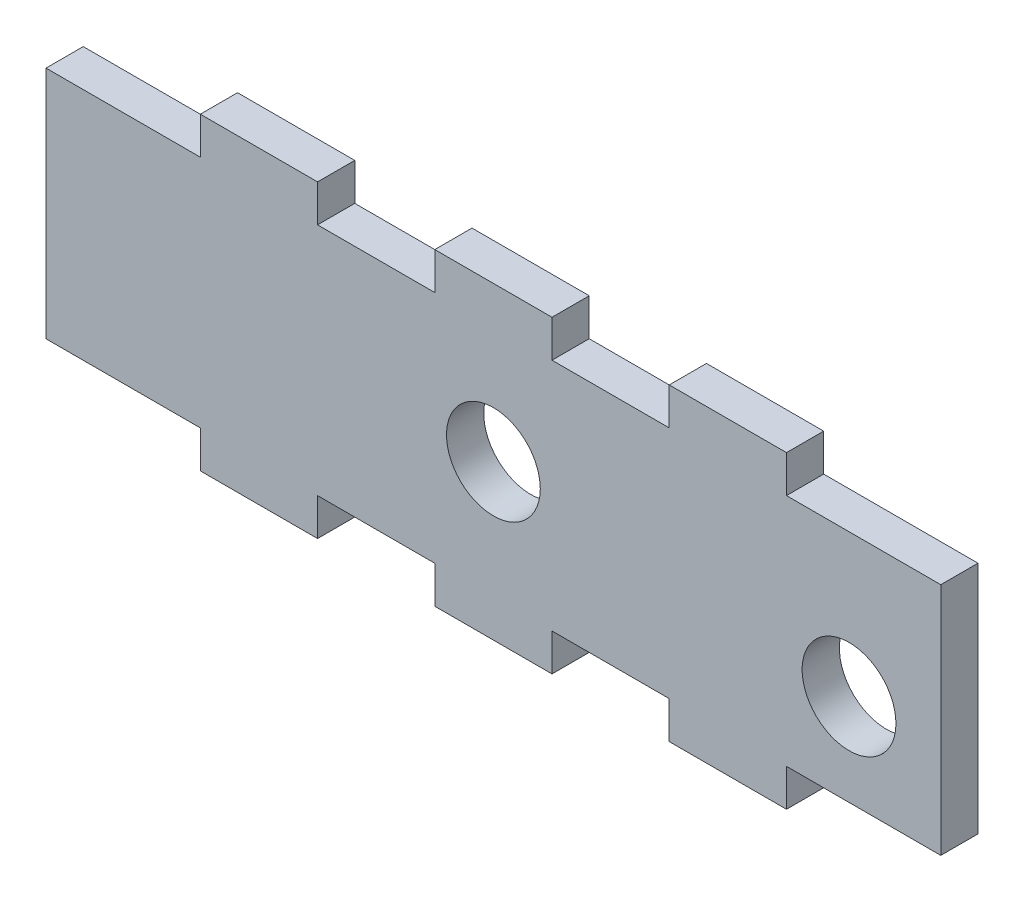
ISO-10303-21;
HEADER;
FILE_DESCRIPTION(('STEP AP214'),'2;1');
FILE_NAME('part.step','',(''),(''),'','','');
FILE_SCHEMA(('AUTOMOTIVE_DESIGN { 1 0 10303 214 1 1 1 1 }'));
ENDSEC;
DATA;
#1=APPLICATION_CONTEXT('core data for automotive mechanical design processes');
#2=APPLICATION_PROTOCOL_DEFINITION('international standard','automotive_design',2000,#1);
#3=PRODUCT_CONTEXT('',#1,'mechanical');
#4=PRODUCT('Part','Part','',(#3));
#5=PRODUCT_RELATED_PRODUCT_CATEGORY('part','',(#4));
#6=PRODUCT_DEFINITION_FORMATION('','',#4);
#7=PRODUCT_DEFINITION_CONTEXT('part definition',#1,'design');
#8=PRODUCT_DEFINITION('design','',#6,#7);
#9=PRODUCT_DEFINITION_SHAPE('','',#8);
#10=(LENGTH_UNIT() NAMED_UNIT(*) SI_UNIT(.MILLI.,.METRE.));
#11=(NAMED_UNIT(*) PLANE_ANGLE_UNIT() SI_UNIT($,.RADIAN.));
#12=(NAMED_UNIT(*) SI_UNIT($,.STERADIAN.) SOLID_ANGLE_UNIT());
#13=UNCERTAINTY_MEASURE_WITH_UNIT(LENGTH_MEASURE(1.E-05),#10,'distance_accuracy_value','');
#14=(GEOMETRIC_REPRESENTATION_CONTEXT(3) GLOBAL_UNCERTAINTY_ASSIGNED_CONTEXT((#13)) GLOBAL_UNIT_ASSIGNED_CONTEXT((#10,
#11,#12)) REPRESENTATION_CONTEXT('',''));
#15=CARTESIAN_POINT('',(0.,0.,0.));
#16=DIRECTION('',(0.,0.,1.));
#17=DIRECTION('',(1.,0.,0.));
#18=AXIS2_PLACEMENT_3D('',#15,#16,#17);
#19=CARTESIAN_POINT('',(-82.675,26.35,6.35));
#20=DIRECTION('',(0.,-1.,0.));
#21=DIRECTION('',(0.,0.,-1.));
#22=AXIS2_PLACEMENT_3D('',#19,#20,#21);
#23=PLANE('',#22);
#24=DIRECTION('',(0.,0.,1.));
#25=VECTOR('',#24,1.);
#26=CARTESIAN_POINT('',(-50.,26.35,0.));
#27=LINE('',#26,#25);
#28=CARTESIAN_POINT('',(-50.,26.35,0.));
#29=VERTEX_POINT('',#28);
#30=CARTESIAN_POINT('',(-50.,26.35,6.35));
#31=VERTEX_POINT('',#30);
#32=EDGE_CURVE('E422',#29,#31,#27,.T.);
#33=ORIENTED_EDGE('',*,*,#32,.T.);
#34=DIRECTION('',(-1.,0.,0.));
#35=VECTOR('',#34,1.);
#36=CARTESIAN_POINT('',(-82.675,26.35,6.35));
#37=LINE('',#36,#35);
#38=CARTESIAN_POINT('',(-30.,26.35,6.35));
#39=VERTEX_POINT('',#38);
#40=EDGE_CURVE('E51',#39,#31,#37,.T.);
#41=ORIENTED_EDGE('',*,*,#40,.F.);
#42=DIRECTION('',(0.,0.,1.));
#43=VECTOR('',#42,1.);
#44=CARTESIAN_POINT('',(-30.,26.35,0.));
#45=LINE('',#44,#43);
#46=CARTESIAN_POINT('',(-30.,26.35,0.));
#47=VERTEX_POINT('',#46);
#48=EDGE_CURVE('E263',#47,#39,#45,.T.);
#49=ORIENTED_EDGE('',*,*,#48,.F.);
#50=DIRECTION('',(-1.,0.,0.));
#51=VECTOR('',#50,1.);
#52=CARTESIAN_POINT('',(-82.675,26.35,0.));
#53=LINE('',#52,#51);
#54=EDGE_CURVE('E43',#47,#29,#53,.T.);
#55=ORIENTED_EDGE('',*,*,#54,.T.);
#56=EDGE_LOOP('',(#33,#41,#49,#55));
#57=FACE_BOUND('',#56,.T.);
#58=ADVANCED_FACE('F39',(#57),#23,.F.);
#59=DIRECTION('',(0.,0.,1.));
#60=VECTOR('',#59,1.);
#61=CARTESIAN_POINT('',(50.,26.35,0.));
#62=LINE('',#61,#60);
#63=CARTESIAN_POINT('',(50.,26.35,0.));
#64=VERTEX_POINT('',#63);
#65=CARTESIAN_POINT('',(50.,26.35,6.35));
#66=VERTEX_POINT('',#65);
#67=EDGE_CURVE('E351',#64,#66,#62,.T.);
#68=ORIENTED_EDGE('',*,*,#67,.F.);
#69=CARTESIAN_POINT('',(30.,26.35,0.));
#70=VERTEX_POINT('',#69);
#71=EDGE_CURVE('E314',#64,#70,#53,.T.);
#72=ORIENTED_EDGE('',*,*,#71,.T.);
#73=DIRECTION('',(0.,0.,1.));
#74=VECTOR('',#73,1.);
#75=CARTESIAN_POINT('',(30.,26.35,0.));
#76=LINE('',#75,#74);
#77=CARTESIAN_POINT('',(30.,26.35,6.35));
#78=VERTEX_POINT('',#77);
#79=EDGE_CURVE('E350',#70,#78,#76,.T.);
#80=ORIENTED_EDGE('',*,*,#79,.T.);
#81=EDGE_CURVE('E11',#66,#78,#37,.T.);
#82=ORIENTED_EDGE('',*,*,#81,.F.);
#83=EDGE_LOOP('',(#68,#72,#80,#82));
#84=FACE_BOUND('',#83,.T.);
#85=ADVANCED_FACE('F348',(#84),#23,.F.);
#86=DIRECTION('',(0.,0.,1.));
#87=VECTOR('',#86,1.);
#88=CARTESIAN_POINT('',(9.99999999999999,26.35,0.));
#89=LINE('',#88,#87);
#90=CARTESIAN_POINT('',(9.99999999999999,26.35,0.));
#91=VERTEX_POINT('',#90);
#92=CARTESIAN_POINT('',(9.99999999999999,26.35,6.35));
#93=VERTEX_POINT('',#92);
#94=EDGE_CURVE('E385',#91,#93,#89,.T.);
#95=ORIENTED_EDGE('',*,*,#94,.F.);
#96=CARTESIAN_POINT('',(-10.,26.35,0.));
#97=VERTEX_POINT('',#96);
#98=EDGE_CURVE('E335',#91,#97,#53,.T.);
#99=ORIENTED_EDGE('',*,*,#98,.T.);
#100=DIRECTION('',(0.,0.,1.));
#101=VECTOR('',#100,1.);
#102=CARTESIAN_POINT('',(-10.,26.35,0.));
#103=LINE('',#102,#101);
#104=CARTESIAN_POINT('',(-10.,26.35,6.35));
#105=VERTEX_POINT('',#104);
#106=EDGE_CURVE('E460',#97,#105,#103,.T.);
#107=ORIENTED_EDGE('',*,*,#106,.T.);
#108=EDGE_CURVE('E49',#93,#105,#37,.T.);
#109=ORIENTED_EDGE('',*,*,#108,.F.);
#110=EDGE_LOOP('',(#95,#99,#107,#109));
#111=FACE_BOUND('',#110,.T.);
#112=ADVANCED_FACE('F587',(#111),#23,.F.);
#113=CARTESIAN_POINT('',(0.,0.,6.35));
#114=DIRECTION('',(0.,0.,1.));
#115=DIRECTION('',(1.,0.,0.));
#116=AXIS2_PLACEMENT_3D('',#113,#114,#115);
#117=PLANE('',#116);
#118=CARTESIAN_POINT('',(0.,0.,6.35));
#119=DIRECTION('',(0.,0.,1.));
#120=DIRECTION('',(1.,0.,0.));
#121=AXIS2_PLACEMENT_3D('',#118,#119,#120);
#122=CIRCLE('',#121,8.);
#123=CARTESIAN_POINT('',(8.,0.,6.35));
#124=VERTEX_POINT('',#123);
#125=EDGE_CURVE('E820',#124,#124,#122,.T.);
#126=ORIENTED_EDGE('',*,*,#125,.F.);
#127=EDGE_LOOP('',(#126));
#128=FACE_BOUND('',#127,.T.);
#129=CARTESIAN_POINT('',(60.675,-4.35,6.35));
#130=DIRECTION('',(0.,0.,1.));
#131=DIRECTION('',(1.,0.,0.));
#132=AXIS2_PLACEMENT_3D('',#129,#130,#131);
#133=CIRCLE('',#132,8.00000000000002);
#134=CARTESIAN_POINT('',(68.675,-4.35,6.35));
#135=VERTEX_POINT('',#134);
#136=EDGE_CURVE('E828',#135,#135,#133,.T.);
#137=ORIENTED_EDGE('',*,*,#136,.F.);
#138=EDGE_LOOP('',(#137));
#139=FACE_BOUND('',#138,.T.);
#140=DIRECTION('',(0.,1.,0.));
#141=VECTOR('',#140,1.);
#142=CARTESIAN_POINT('',(-76.325,26.35,6.35));
#143=LINE('',#142,#141);
#144=CARTESIAN_POINT('',(-76.325,-20.,6.35));
#145=VERTEX_POINT('',#144);
#146=CARTESIAN_POINT('',(-76.325,20.,6.35));
#147=VERTEX_POINT('',#146);
#148=EDGE_CURVE('E230',#145,#147,#143,.T.);
#149=ORIENTED_EDGE('',*,*,#148,.F.);
#150=DIRECTION('',(-1.,0.,0.));
#151=VECTOR('',#150,1.);
#152=CARTESIAN_POINT('',(-50.,-20.,6.35));
#153=LINE('',#152,#151);
#154=CARTESIAN_POINT('',(-50.,-20.,6.35));
#155=VERTEX_POINT('',#154);
#156=EDGE_CURVE('E247',#155,#145,#153,.T.);
#157=ORIENTED_EDGE('',*,*,#156,.F.);
#158=DIRECTION('',(0.,1.,0.));
#159=VECTOR('',#158,1.);
#160=CARTESIAN_POINT('',(-50.,-26.35,6.35));
#161=LINE('',#160,#159);
#162=CARTESIAN_POINT('',(-50.,-26.35,6.35));
#163=VERTEX_POINT('',#162);
#164=EDGE_CURVE('E256',#163,#155,#161,.T.);
#165=ORIENTED_EDGE('',*,*,#164,.F.);
#166=DIRECTION('',(1.,0.,0.));
#167=VECTOR('',#166,1.);
#168=CARTESIAN_POINT('',(-82.675,-26.35,6.35));
#169=LINE('',#168,#167);
#170=CARTESIAN_POINT('',(-30.,-26.35,6.35));
#171=VERTEX_POINT('',#170);
#172=EDGE_CURVE('E315',#163,#171,#169,.T.);
#173=ORIENTED_EDGE('',*,*,#172,.T.);
#174=DIRECTION('',(0.,-1.,0.));
#175=VECTOR('',#174,1.);
#176=CARTESIAN_POINT('',(-30.,-26.35,6.35));
#177=LINE('',#176,#175);
#178=CARTESIAN_POINT('',(-30.,-20.,6.35));
#179=VERTEX_POINT('',#178);
#180=EDGE_CURVE('E286',#179,#171,#177,.T.);
#181=ORIENTED_EDGE('',*,*,#180,.F.);
#182=DIRECTION('',(-1.,0.,0.));
#183=VECTOR('',#182,1.);
#184=CARTESIAN_POINT('',(-30.,-20.,6.35));
#185=LINE('',#184,#183);
#186=CARTESIAN_POINT('',(-10.,-20.,6.35));
#187=VERTEX_POINT('',#186);
#188=EDGE_CURVE('E277',#187,#179,#185,.T.);
#189=ORIENTED_EDGE('',*,*,#188,.F.);
#190=DIRECTION('',(0.,1.,0.));
#191=VECTOR('',#190,1.);
#192=CARTESIAN_POINT('',(-10.,-26.35,6.35));
#193=LINE('',#192,#191);
#194=CARTESIAN_POINT('',(-10.,-26.35,6.35));
#195=VERTEX_POINT('',#194);
#196=EDGE_CURVE('E289',#195,#187,#193,.T.);
#197=ORIENTED_EDGE('',*,*,#196,.F.);
#198=CARTESIAN_POINT('',(9.99999999999999,-26.35,6.35));
#199=VERTEX_POINT('',#198);
#200=EDGE_CURVE('E313',#195,#199,#169,.T.);
#201=ORIENTED_EDGE('',*,*,#200,.T.);
#202=DIRECTION('',(0.,-1.,0.));
#203=VECTOR('',#202,1.);
#204=CARTESIAN_POINT('',(9.99999999999999,-26.35,6.35));
#205=LINE('',#204,#203);
#206=CARTESIAN_POINT('',(9.99999999999999,-20.,6.35));
#207=VERTEX_POINT('',#206);
#208=EDGE_CURVE('E483',#207,#199,#205,.T.);
#209=ORIENTED_EDGE('',*,*,#208,.F.);
#210=DIRECTION('',(-1.,0.,0.));
#211=VECTOR('',#210,1.);
#212=CARTESIAN_POINT('',(9.99999999999999,-20.,6.35));
#213=LINE('',#212,#211);
#214=CARTESIAN_POINT('',(30.,-20.,6.35));
#215=VERTEX_POINT('',#214);
#216=EDGE_CURVE('E474',#215,#207,#213,.T.);
#217=ORIENTED_EDGE('',*,*,#216,.F.);
#218=DIRECTION('',(0.,1.,0.));
#219=VECTOR('',#218,1.);
#220=CARTESIAN_POINT('',(30.,-26.35,6.35));
#221=LINE('',#220,#219);
#222=CARTESIAN_POINT('',(30.,-26.35,6.35));
#223=VERTEX_POINT('',#222);
#224=EDGE_CURVE('E486',#223,#215,#221,.T.);
#225=ORIENTED_EDGE('',*,*,#224,.F.);
#226=CARTESIAN_POINT('',(50.,-26.35,6.35));
#227=VERTEX_POINT('',#226);
#228=EDGE_CURVE('E310',#223,#227,#169,.T.);
#229=ORIENTED_EDGE('',*,*,#228,.T.);
#230=DIRECTION('',(0.,-1.,0.));
#231=VECTOR('',#230,1.);
#232=CARTESIAN_POINT('',(50.,-26.35,6.35));
#233=LINE('',#232,#231);
#234=CARTESIAN_POINT('',(50.,-20.,6.35));
#235=VERTEX_POINT('',#234);
#236=EDGE_CURVE('E268',#235,#227,#233,.T.);
#237=ORIENTED_EDGE('',*,*,#236,.F.);
#238=DIRECTION('',(-1.,0.,0.));
#239=VECTOR('',#238,1.);
#240=CARTESIAN_POINT('',(50.,-20.,6.35));
#241=LINE('',#240,#239);
#242=CARTESIAN_POINT('',(76.325,-20.,6.35));
#243=VERTEX_POINT('',#242);
#244=EDGE_CURVE('E510',#243,#235,#241,.T.);
#245=ORIENTED_EDGE('',*,*,#244,.F.);
#246=DIRECTION('',(0.,-1.,0.));
#247=VECTOR('',#246,1.);
#248=CARTESIAN_POINT('',(76.325,-26.35,6.35));
#249=LINE('',#248,#247);
#250=CARTESIAN_POINT('',(76.325,20.,6.35));
#251=VERTEX_POINT('',#250);
#252=EDGE_CURVE('E566',#251,#243,#249,.T.);
#253=ORIENTED_EDGE('',*,*,#252,.F.);
#254=DIRECTION('',(-1.,0.,0.));
#255=VECTOR('',#254,1.);
#256=CARTESIAN_POINT('',(50.,20.,6.35));
#257=LINE('',#256,#255);
#258=CARTESIAN_POINT('',(50.,20.,6.35));
#259=VERTEX_POINT('',#258);
#260=EDGE_CURVE('E396',#251,#259,#257,.T.);
#261=ORIENTED_EDGE('',*,*,#260,.T.);
#262=DIRECTION('',(0.,1.,0.));
#263=VECTOR('',#262,1.);
#264=CARTESIAN_POINT('',(50.,26.35,6.35));
#265=LINE('',#264,#263);
#266=EDGE_CURVE('E400',#259,#66,#265,.T.);
#267=ORIENTED_EDGE('',*,*,#266,.T.);
#268=ORIENTED_EDGE('',*,*,#81,.T.);
#269=DIRECTION('',(0.,-1.,0.));
#270=VECTOR('',#269,1.);
#271=CARTESIAN_POINT('',(30.,26.35,6.35));
#272=LINE('',#271,#270);
#273=CARTESIAN_POINT('',(30.,20.,6.35));
#274=VERTEX_POINT('',#273);
#275=EDGE_CURVE('E381',#78,#274,#272,.T.);
#276=ORIENTED_EDGE('',*,*,#275,.T.);
#277=DIRECTION('',(-1.,0.,0.));
#278=VECTOR('',#277,1.);
#279=CARTESIAN_POINT('',(9.99999999999999,20.,6.35));
#280=LINE('',#279,#278);
#281=CARTESIAN_POINT('',(9.99999999999999,20.,6.35));
#282=VERTEX_POINT('',#281);
#283=EDGE_CURVE('E377',#274,#282,#280,.T.);
#284=ORIENTED_EDGE('',*,*,#283,.T.);
#285=DIRECTION('',(0.,1.,0.));
#286=VECTOR('',#285,1.);
#287=CARTESIAN_POINT('',(9.99999999999999,26.35,6.35));
#288=LINE('',#287,#286);
#289=EDGE_CURVE('E373',#282,#93,#288,.T.);
#290=ORIENTED_EDGE('',*,*,#289,.T.);
#291=ORIENTED_EDGE('',*,*,#108,.T.);
#292=DIRECTION('',(0.,-1.,0.));
#293=VECTOR('',#292,1.);
#294=CARTESIAN_POINT('',(-10.,26.35,6.35));
#295=LINE('',#294,#293);
#296=CARTESIAN_POINT('',(-10.,20.,6.35));
#297=VERTEX_POINT('',#296);
#298=EDGE_CURVE('E440',#105,#297,#295,.T.);
#299=ORIENTED_EDGE('',*,*,#298,.T.);
#300=DIRECTION('',(-1.,0.,0.));
#301=VECTOR('',#300,1.);
#302=CARTESIAN_POINT('',(-30.,20.,6.35));
#303=LINE('',#302,#301);
#304=CARTESIAN_POINT('',(-30.,20.,6.35));
#305=VERTEX_POINT('',#304);
#306=EDGE_CURVE('E451',#297,#305,#303,.T.);
#307=ORIENTED_EDGE('',*,*,#306,.T.);
#308=DIRECTION('',(0.,1.,0.));
#309=VECTOR('',#308,1.);
#310=CARTESIAN_POINT('',(-30.,26.35,6.35));
#311=LINE('',#310,#309);
#312=EDGE_CURVE('E388',#305,#39,#311,.T.);
#313=ORIENTED_EDGE('',*,*,#312,.T.);
#314=ORIENTED_EDGE('',*,*,#40,.T.);
#315=DIRECTION('',(0.,-1.,0.));
#316=VECTOR('',#315,1.);
#317=CARTESIAN_POINT('',(-50.,26.35,6.35));
#318=LINE('',#317,#316);
#319=CARTESIAN_POINT('',(-50.,20.,6.35));
#320=VERTEX_POINT('',#319);
#321=EDGE_CURVE('E423',#31,#320,#318,.T.);
#322=ORIENTED_EDGE('',*,*,#321,.T.);
#323=DIRECTION('',(-1.,0.,0.));
#324=VECTOR('',#323,1.);
#325=CARTESIAN_POINT('',(-50.,20.,6.35));
#326=LINE('',#325,#324);
#327=EDGE_CURVE('E249',#320,#147,#326,.T.);
#328=ORIENTED_EDGE('',*,*,#327,.T.);
#329=EDGE_LOOP('',(#149,#157,#165,#173,#181,#189,#197,#201,#209,#217,#225,#229,#237,#245,#253,
#261,#267,#268,#276,#284,#290,#291,#299,#307,#313,#314,#322,#328));
#330=FACE_BOUND('',#329,.T.);
#331=ADVANCED_FACE('F245',(#128,#139,#330),#117,.T.);
#332=CARTESIAN_POINT('',(0.,0.,0.));
#333=DIRECTION('',(0.,0.,1.));
#334=DIRECTION('',(1.,0.,0.));
#335=AXIS2_PLACEMENT_3D('',#332,#333,#334);
#336=PLANE('',#335);
#337=CARTESIAN_POINT('',(0.,0.,0.));
#338=DIRECTION('',(0.,0.,1.));
#339=DIRECTION('',(1.,0.,0.));
#340=AXIS2_PLACEMENT_3D('',#337,#338,#339);
#341=CIRCLE('',#340,8.);
#342=CARTESIAN_POINT('',(8.,0.,0.));
#343=VERTEX_POINT('',#342);
#344=EDGE_CURVE('E569',#343,#343,#341,.T.);
#345=ORIENTED_EDGE('',*,*,#344,.T.);
#346=EDGE_LOOP('',(#345));
#347=FACE_BOUND('',#346,.T.);
#348=CARTESIAN_POINT('',(60.675,-4.35,0.));
#349=DIRECTION('',(0.,0.,1.));
#350=DIRECTION('',(1.,0.,0.));
#351=AXIS2_PLACEMENT_3D('',#348,#349,#350);
#352=CIRCLE('',#351,8.00000000000002);
#353=CARTESIAN_POINT('',(68.675,-4.35,0.));
#354=VERTEX_POINT('',#353);
#355=EDGE_CURVE('E822',#354,#354,#352,.T.);
#356=ORIENTED_EDGE('',*,*,#355,.T.);
#357=EDGE_LOOP('',(#356));
#358=FACE_BOUND('',#357,.T.);
#359=DIRECTION('',(-1.,0.,0.));
#360=VECTOR('',#359,1.);
#361=CARTESIAN_POINT('',(-50.,-20.,0.));
#362=LINE('',#361,#360);
#363=CARTESIAN_POINT('',(-50.,-20.,0.));
#364=VERTEX_POINT('',#363);
#365=CARTESIAN_POINT('',(-76.325,-20.,0.));
#366=VERTEX_POINT('',#365);
#367=EDGE_CURVE('E261',#364,#366,#362,.T.);
#368=ORIENTED_EDGE('',*,*,#367,.T.);
#369=DIRECTION('',(0.,1.,0.));
#370=VECTOR('',#369,1.);
#371=CARTESIAN_POINT('',(-76.325,26.35,0.));
#372=LINE('',#371,#370);
#373=CARTESIAN_POINT('',(-76.325,20.,0.));
#374=VERTEX_POINT('',#373);
#375=EDGE_CURVE('E233',#366,#374,#372,.T.);
#376=ORIENTED_EDGE('',*,*,#375,.T.);
#377=DIRECTION('',(-1.,0.,0.));
#378=VECTOR('',#377,1.);
#379=CARTESIAN_POINT('',(-50.,20.,0.));
#380=LINE('',#379,#378);
#381=CARTESIAN_POINT('',(-50.,20.,0.));
#382=VERTEX_POINT('',#381);
#383=EDGE_CURVE('E418',#382,#374,#380,.T.);
#384=ORIENTED_EDGE('',*,*,#383,.F.);
#385=DIRECTION('',(0.,-1.,0.));
#386=VECTOR('',#385,1.);
#387=CARTESIAN_POINT('',(-50.,26.35,0.));
#388=LINE('',#387,#386);
#389=EDGE_CURVE('E415',#29,#382,#388,.T.);
#390=ORIENTED_EDGE('',*,*,#389,.F.);
#391=ORIENTED_EDGE('',*,*,#54,.F.);
#392=DIRECTION('',(0.,1.,0.));
#393=VECTOR('',#392,1.);
#394=CARTESIAN_POINT('',(-30.,26.35,0.));
#395=LINE('',#394,#393);
#396=CARTESIAN_POINT('',(-30.,20.,0.));
#397=VERTEX_POINT('',#396);
#398=EDGE_CURVE('E436',#397,#47,#395,.T.);
#399=ORIENTED_EDGE('',*,*,#398,.F.);
#400=DIRECTION('',(-1.,0.,0.));
#401=VECTOR('',#400,1.);
#402=CARTESIAN_POINT('',(-30.,20.,0.));
#403=LINE('',#402,#401);
#404=CARTESIAN_POINT('',(-10.,20.,0.));
#405=VERTEX_POINT('',#404);
#406=EDGE_CURVE('E439',#405,#397,#403,.T.);
#407=ORIENTED_EDGE('',*,*,#406,.F.);
#408=DIRECTION('',(0.,-1.,0.));
#409=VECTOR('',#408,1.);
#410=CARTESIAN_POINT('',(-10.,26.35,0.));
#411=LINE('',#410,#409);
#412=EDGE_CURVE('E443',#97,#405,#411,.T.);
#413=ORIENTED_EDGE('',*,*,#412,.F.);
#414=ORIENTED_EDGE('',*,*,#98,.F.);
#415=DIRECTION('',(0.,1.,0.));
#416=VECTOR('',#415,1.);
#417=CARTESIAN_POINT('',(9.99999999999999,26.35,0.));
#418=LINE('',#417,#416);
#419=CARTESIAN_POINT('',(9.99999999999999,20.,0.));
#420=VERTEX_POINT('',#419);
#421=EDGE_CURVE('E369',#420,#91,#418,.T.);
#422=ORIENTED_EDGE('',*,*,#421,.F.);
#423=DIRECTION('',(-1.,0.,0.));
#424=VECTOR('',#423,1.);
#425=CARTESIAN_POINT('',(9.99999999999999,20.,0.));
#426=LINE('',#425,#424);
#427=CARTESIAN_POINT('',(30.,20.,0.));
#428=VERTEX_POINT('',#427);
#429=EDGE_CURVE('E361',#428,#420,#426,.T.);
#430=ORIENTED_EDGE('',*,*,#429,.F.);
#431=DIRECTION('',(0.,-1.,0.));
#432=VECTOR('',#431,1.);
#433=CARTESIAN_POINT('',(30.,26.35,0.));
#434=LINE('',#433,#432);
#435=EDGE_CURVE('E359',#70,#428,#434,.T.);
#436=ORIENTED_EDGE('',*,*,#435,.F.);
#437=ORIENTED_EDGE('',*,*,#71,.F.);
#438=DIRECTION('',(0.,1.,0.));
#439=VECTOR('',#438,1.);
#440=CARTESIAN_POINT('',(50.,26.35,0.));
#441=LINE('',#440,#439);
#442=CARTESIAN_POINT('',(50.,20.,0.));
#443=VERTEX_POINT('',#442);
#444=EDGE_CURVE('E357',#443,#64,#441,.T.);
#445=ORIENTED_EDGE('',*,*,#444,.F.);
#446=DIRECTION('',(-1.,0.,0.));
#447=VECTOR('',#446,1.);
#448=CARTESIAN_POINT('',(50.,20.,0.));
#449=LINE('',#448,#447);
#450=CARTESIAN_POINT('',(76.325,20.,0.));
#451=VERTEX_POINT('',#450);
#452=EDGE_CURVE('E395',#451,#443,#449,.T.);
#453=ORIENTED_EDGE('',*,*,#452,.F.);
#454=DIRECTION('',(0.,-1.,0.));
#455=VECTOR('',#454,1.);
#456=CARTESIAN_POINT('',(76.325,-26.35,0.));
#457=LINE('',#456,#455);
#458=CARTESIAN_POINT('',(76.325,-20.,0.));
#459=VERTEX_POINT('',#458);
#460=EDGE_CURVE('E58',#451,#459,#457,.T.);
#461=ORIENTED_EDGE('',*,*,#460,.T.);
#462=DIRECTION('',(-1.,0.,0.));
#463=VECTOR('',#462,1.);
#464=CARTESIAN_POINT('',(50.,-20.,0.));
#465=LINE('',#464,#463);
#466=CARTESIAN_POINT('',(50.,-20.,0.));
#467=VERTEX_POINT('',#466);
#468=EDGE_CURVE('E509',#459,#467,#465,.T.);
#469=ORIENTED_EDGE('',*,*,#468,.T.);
#470=DIRECTION('',(0.,-1.,0.));
#471=VECTOR('',#470,1.);
#472=CARTESIAN_POINT('',(50.,-26.35,0.));
#473=LINE('',#472,#471);
#474=CARTESIAN_POINT('',(50.,-26.35,0.));
#475=VERTEX_POINT('',#474);
#476=EDGE_CURVE('E505',#467,#475,#473,.T.);
#477=ORIENTED_EDGE('',*,*,#476,.T.);
#478=DIRECTION('',(1.,0.,0.));
#479=VECTOR('',#478,1.);
#480=CARTESIAN_POINT('',(-82.675,-26.35,0.));
#481=LINE('',#480,#479);
#482=CARTESIAN_POINT('',(30.,-26.35,0.));
#483=VERTEX_POINT('',#482);
#484=EDGE_CURVE('E300',#483,#475,#481,.T.);
#485=ORIENTED_EDGE('',*,*,#484,.F.);
#486=DIRECTION('',(0.,1.,0.));
#487=VECTOR('',#486,1.);
#488=CARTESIAN_POINT('',(30.,-26.35,0.));
#489=LINE('',#488,#487);
#490=CARTESIAN_POINT('',(30.,-20.,0.));
#491=VERTEX_POINT('',#490);
#492=EDGE_CURVE('E473',#483,#491,#489,.T.);
#493=ORIENTED_EDGE('',*,*,#492,.T.);
#494=DIRECTION('',(-1.,0.,0.));
#495=VECTOR('',#494,1.);
#496=CARTESIAN_POINT('',(9.99999999999999,-20.,0.));
#497=LINE('',#496,#495);
#498=CARTESIAN_POINT('',(9.99999999999999,-20.,0.));
#499=VERTEX_POINT('',#498);
#500=EDGE_CURVE('E478',#491,#499,#497,.T.);
#501=ORIENTED_EDGE('',*,*,#500,.T.);
#502=DIRECTION('',(0.,-1.,0.));
#503=VECTOR('',#502,1.);
#504=CARTESIAN_POINT('',(9.99999999999999,-26.35,0.));
#505=LINE('',#504,#503);
#506=CARTESIAN_POINT('',(9.99999999999999,-26.35,0.));
#507=VERTEX_POINT('',#506);
#508=EDGE_CURVE('E469',#499,#507,#505,.T.);
#509=ORIENTED_EDGE('',*,*,#508,.T.);
#510=CARTESIAN_POINT('',(-10.,-26.35,0.));
#511=VERTEX_POINT('',#510);
#512=EDGE_CURVE('E320',#511,#507,#481,.T.);
#513=ORIENTED_EDGE('',*,*,#512,.F.);
#514=DIRECTION('',(0.,1.,0.));
#515=VECTOR('',#514,1.);
#516=CARTESIAN_POINT('',(-10.,-26.35,0.));
#517=LINE('',#516,#515);
#518=CARTESIAN_POINT('',(-10.,-20.,0.));
#519=VERTEX_POINT('',#518);
#520=EDGE_CURVE('E276',#511,#519,#517,.T.);
#521=ORIENTED_EDGE('',*,*,#520,.T.);
#522=DIRECTION('',(-1.,0.,0.));
#523=VECTOR('',#522,1.);
#524=CARTESIAN_POINT('',(-30.,-20.,0.));
#525=LINE('',#524,#523);
#526=CARTESIAN_POINT('',(-30.,-20.,0.));
#527=VERTEX_POINT('',#526);
#528=EDGE_CURVE('E281',#519,#527,#525,.T.);
#529=ORIENTED_EDGE('',*,*,#528,.T.);
#530=DIRECTION('',(0.,-1.,0.));
#531=VECTOR('',#530,1.);
#532=CARTESIAN_POINT('',(-30.,-26.35,0.));
#533=LINE('',#532,#531);
#534=CARTESIAN_POINT('',(-30.,-26.35,0.));
#535=VERTEX_POINT('',#534);
#536=EDGE_CURVE('E272',#527,#535,#533,.T.);
#537=ORIENTED_EDGE('',*,*,#536,.T.);
#538=CARTESIAN_POINT('',(-50.,-26.35,0.));
#539=VERTEX_POINT('',#538);
#540=EDGE_CURVE('E321',#539,#535,#481,.T.);
#541=ORIENTED_EDGE('',*,*,#540,.F.);
#542=DIRECTION('',(0.,1.,0.));
#543=VECTOR('',#542,1.);
#544=CARTESIAN_POINT('',(-50.,-26.35,0.));
#545=LINE('',#544,#543);
#546=EDGE_CURVE('E255',#539,#364,#545,.T.);
#547=ORIENTED_EDGE('',*,*,#546,.T.);
#548=EDGE_LOOP('',(#368,#376,#384,#390,#391,#399,#407,#413,#414,#422,#430,#436,#437,#445,#453,
#461,#469,#477,#485,#493,#501,#509,#513,#521,#529,#537,#541,#547));
#549=FACE_BOUND('',#548,.T.);
#550=ADVANCED_FACE('F355',(#347,#358,#549),#336,.F.);
#551=CARTESIAN_POINT('',(-82.675,-26.35,6.35));
#552=DIRECTION('',(0.,1.,0.));
#553=DIRECTION('',(0.,0.,1.));
#554=AXIS2_PLACEMENT_3D('',#551,#552,#553);
#555=PLANE('',#554);
#556=ORIENTED_EDGE('',*,*,#172,.F.);
#557=DIRECTION('',(0.,0.,1.));
#558=VECTOR('',#557,1.);
#559=CARTESIAN_POINT('',(-50.,-26.35,0.));
#560=LINE('',#559,#558);
#561=EDGE_CURVE('E239',#539,#163,#560,.T.);
#562=ORIENTED_EDGE('',*,*,#561,.F.);
#563=ORIENTED_EDGE('',*,*,#540,.T.);
#564=DIRECTION('',(0.,0.,1.));
#565=VECTOR('',#564,1.);
#566=CARTESIAN_POINT('',(-30.,-26.35,0.));
#567=LINE('',#566,#565);
#568=EDGE_CURVE('E285',#535,#171,#567,.T.);
#569=ORIENTED_EDGE('',*,*,#568,.T.);
#570=EDGE_LOOP('',(#556,#562,#563,#569));
#571=FACE_BOUND('',#570,.T.);
#572=ADVANCED_FACE('F41',(#571),#555,.F.);
#573=ORIENTED_EDGE('',*,*,#484,.T.);
#574=DIRECTION('',(0.,0.,1.));
#575=VECTOR('',#574,1.);
#576=CARTESIAN_POINT('',(50.,-26.35,0.));
#577=LINE('',#576,#575);
#578=EDGE_CURVE('E514',#475,#227,#577,.T.);
#579=ORIENTED_EDGE('',*,*,#578,.T.);
#580=ORIENTED_EDGE('',*,*,#228,.F.);
#581=DIRECTION('',(0.,0.,1.));
#582=VECTOR('',#581,1.);
#583=CARTESIAN_POINT('',(30.,-26.35,0.));
#584=LINE('',#583,#582);
#585=EDGE_CURVE('E499',#483,#223,#584,.T.);
#586=ORIENTED_EDGE('',*,*,#585,.F.);
#587=EDGE_LOOP('',(#573,#579,#580,#586));
#588=FACE_BOUND('',#587,.T.);
#589=ADVANCED_FACE('F557',(#588),#555,.F.);
#590=ORIENTED_EDGE('',*,*,#512,.T.);
#591=DIRECTION('',(0.,0.,1.));
#592=VECTOR('',#591,1.);
#593=CARTESIAN_POINT('',(9.99999999999999,-26.35,0.));
#594=LINE('',#593,#592);
#595=EDGE_CURVE('E482',#507,#199,#594,.T.);
#596=ORIENTED_EDGE('',*,*,#595,.T.);
#597=ORIENTED_EDGE('',*,*,#200,.F.);
#598=DIRECTION('',(0.,0.,1.));
#599=VECTOR('',#598,1.);
#600=CARTESIAN_POINT('',(-10.,-26.35,0.));
#601=LINE('',#600,#599);
#602=EDGE_CURVE('E304',#511,#195,#601,.T.);
#603=ORIENTED_EDGE('',*,*,#602,.F.);
#604=EDGE_LOOP('',(#590,#596,#597,#603));
#605=FACE_BOUND('',#604,.T.);
#606=ADVANCED_FACE('F544',(#605),#555,.F.);
#607=CARTESIAN_POINT('',(-30.,-26.35,0.));
#608=DIRECTION('',(-1.,0.,0.));
#609=DIRECTION('',(0.,0.,1.));
#610=AXIS2_PLACEMENT_3D('',#607,#608,#609);
#611=PLANE('',#610);
#612=ORIENTED_EDGE('',*,*,#180,.T.);
#613=ORIENTED_EDGE('',*,*,#568,.F.);
#614=ORIENTED_EDGE('',*,*,#536,.F.);
#615=DIRECTION('',(0.,0.,1.));
#616=VECTOR('',#615,1.);
#617=CARTESIAN_POINT('',(-30.,-20.,0.));
#618=LINE('',#617,#616);
#619=EDGE_CURVE('E297',#527,#179,#618,.T.);
#620=ORIENTED_EDGE('',*,*,#619,.T.);
#621=EDGE_LOOP('',(#612,#613,#614,#620));
#622=FACE_BOUND('',#621,.T.);
#623=ADVANCED_FACE('F637',(#622),#611,.F.);
#624=CARTESIAN_POINT('',(-30.,-20.,0.));
#625=DIRECTION('',(0.,1.,0.));
#626=DIRECTION('',(0.,0.,1.));
#627=AXIS2_PLACEMENT_3D('',#624,#625,#626);
#628=PLANE('',#627);
#629=ORIENTED_EDGE('',*,*,#188,.T.);
#630=ORIENTED_EDGE('',*,*,#619,.F.);
#631=ORIENTED_EDGE('',*,*,#528,.F.);
#632=DIRECTION('',(0.,0.,1.));
#633=VECTOR('',#632,1.);
#634=CARTESIAN_POINT('',(-10.,-20.,0.));
#635=LINE('',#634,#633);
#636=EDGE_CURVE('E301',#519,#187,#635,.T.);
#637=ORIENTED_EDGE('',*,*,#636,.T.);
#638=EDGE_LOOP('',(#629,#630,#631,#637));
#639=FACE_BOUND('',#638,.T.);
#640=ADVANCED_FACE('F640',(#639),#628,.F.);
#641=CARTESIAN_POINT('',(-10.,-26.35,0.));
#642=DIRECTION('',(1.,0.,0.));
#643=DIRECTION('',(0.,0.,-1.));
#644=AXIS2_PLACEMENT_3D('',#641,#642,#643);
#645=PLANE('',#644);
#646=ORIENTED_EDGE('',*,*,#196,.T.);
#647=ORIENTED_EDGE('',*,*,#636,.F.);
#648=ORIENTED_EDGE('',*,*,#520,.F.);
#649=ORIENTED_EDGE('',*,*,#602,.T.);
#650=EDGE_LOOP('',(#646,#647,#648,#649));
#651=FACE_BOUND('',#650,.T.);
#652=ADVANCED_FACE('F642',(#651),#645,.F.);
#653=CARTESIAN_POINT('',(9.99999999999999,-26.35,0.));
#654=DIRECTION('',(-1.,0.,0.));
#655=DIRECTION('',(0.,0.,1.));
#656=AXIS2_PLACEMENT_3D('',#653,#654,#655);
#657=PLANE('',#656);
#658=ORIENTED_EDGE('',*,*,#208,.T.);
#659=ORIENTED_EDGE('',*,*,#595,.F.);
#660=ORIENTED_EDGE('',*,*,#508,.F.);
#661=DIRECTION('',(0.,0.,1.));
#662=VECTOR('',#661,1.);
#663=CARTESIAN_POINT('',(9.99999999999999,-20.,0.));
#664=LINE('',#663,#662);
#665=EDGE_CURVE('E290',#499,#207,#664,.T.);
#666=ORIENTED_EDGE('',*,*,#665,.T.);
#667=EDGE_LOOP('',(#658,#659,#660,#666));
#668=FACE_BOUND('',#667,.T.);
#669=ADVANCED_FACE('F548',(#668),#657,.F.);
#670=CARTESIAN_POINT('',(9.99999999999999,-20.,0.));
#671=DIRECTION('',(0.,1.,0.));
#672=DIRECTION('',(0.,0.,1.));
#673=AXIS2_PLACEMENT_3D('',#670,#671,#672);
#674=PLANE('',#673);
#675=ORIENTED_EDGE('',*,*,#216,.T.);
#676=ORIENTED_EDGE('',*,*,#665,.F.);
#677=ORIENTED_EDGE('',*,*,#500,.F.);
#678=DIRECTION('',(0.,0.,1.));
#679=VECTOR('',#678,1.);
#680=CARTESIAN_POINT('',(30.,-20.,0.));
#681=LINE('',#680,#679);
#682=EDGE_CURVE('E496',#491,#215,#681,.T.);
#683=ORIENTED_EDGE('',*,*,#682,.T.);
#684=EDGE_LOOP('',(#675,#676,#677,#683));
#685=FACE_BOUND('',#684,.T.);
#686=ADVANCED_FACE('F551',(#685),#674,.F.);
#687=CARTESIAN_POINT('',(30.,-26.35,0.));
#688=DIRECTION('',(1.,0.,0.));
#689=DIRECTION('',(0.,0.,-1.));
#690=AXIS2_PLACEMENT_3D('',#687,#688,#689);
#691=PLANE('',#690);
#692=ORIENTED_EDGE('',*,*,#224,.T.);
#693=ORIENTED_EDGE('',*,*,#682,.F.);
#694=ORIENTED_EDGE('',*,*,#492,.F.);
#695=ORIENTED_EDGE('',*,*,#585,.T.);
#696=EDGE_LOOP('',(#692,#693,#694,#695));
#697=FACE_BOUND('',#696,.T.);
#698=ADVANCED_FACE('F553',(#697),#691,.F.);
#699=CARTESIAN_POINT('',(50.,-26.35,0.));
#700=DIRECTION('',(-1.,0.,0.));
#701=DIRECTION('',(0.,0.,1.));
#702=AXIS2_PLACEMENT_3D('',#699,#700,#701);
#703=PLANE('',#702);
#704=ORIENTED_EDGE('',*,*,#236,.T.);
#705=ORIENTED_EDGE('',*,*,#578,.F.);
#706=ORIENTED_EDGE('',*,*,#476,.F.);
#707=DIRECTION('',(0.,0.,1.));
#708=VECTOR('',#707,1.);
#709=CARTESIAN_POINT('',(50.,-20.,0.));
#710=LINE('',#709,#708);
#711=EDGE_CURVE('E487',#467,#235,#710,.T.);
#712=ORIENTED_EDGE('',*,*,#711,.T.);
#713=EDGE_LOOP('',(#704,#705,#706,#712));
#714=FACE_BOUND('',#713,.T.);
#715=ADVANCED_FACE('F560',(#714),#703,.F.);
#716=CARTESIAN_POINT('',(50.,-20.,0.));
#717=DIRECTION('',(0.,1.,0.));
#718=DIRECTION('',(0.,0.,1.));
#719=AXIS2_PLACEMENT_3D('',#716,#717,#718);
#720=PLANE('',#719);
#721=ORIENTED_EDGE('',*,*,#244,.T.);
#722=ORIENTED_EDGE('',*,*,#711,.F.);
#723=ORIENTED_EDGE('',*,*,#468,.F.);
#724=DIRECTION('',(0.,0.,1.));
#725=VECTOR('',#724,1.);
#726=CARTESIAN_POINT('',(76.325,-20.,0.));
#727=LINE('',#726,#725);
#728=EDGE_CURVE('E522',#459,#243,#727,.T.);
#729=ORIENTED_EDGE('',*,*,#728,.T.);
#730=EDGE_LOOP('',(#721,#722,#723,#729));
#731=FACE_BOUND('',#730,.T.);
#732=ADVANCED_FACE('F563',(#731),#720,.F.);
#733=CARTESIAN_POINT('',(-50.,-26.35,0.));
#734=DIRECTION('',(1.,0.,0.));
#735=DIRECTION('',(0.,0.,-1.));
#736=AXIS2_PLACEMENT_3D('',#733,#734,#735);
#737=PLANE('',#736);
#738=ORIENTED_EDGE('',*,*,#164,.T.);
#739=DIRECTION('',(0.,0.,1.));
#740=VECTOR('',#739,1.);
#741=CARTESIAN_POINT('',(-50.,-20.,0.));
#742=LINE('',#741,#740);
#743=EDGE_CURVE('E240',#364,#155,#742,.T.);
#744=ORIENTED_EDGE('',*,*,#743,.F.);
#745=ORIENTED_EDGE('',*,*,#546,.F.);
#746=ORIENTED_EDGE('',*,*,#561,.T.);
#747=EDGE_LOOP('',(#738,#744,#745,#746));
#748=FACE_BOUND('',#747,.T.);
#749=ADVANCED_FACE('F530',(#748),#737,.F.);
#750=CARTESIAN_POINT('',(-50.,-20.,0.));
#751=DIRECTION('',(0.,1.,0.));
#752=DIRECTION('',(-1.,0.,0.));
#753=AXIS2_PLACEMENT_3D('',#750,#751,#752);
#754=PLANE('',#753);
#755=ORIENTED_EDGE('',*,*,#156,.T.);
#756=DIRECTION('',(0.,0.,1.));
#757=VECTOR('',#756,1.);
#758=CARTESIAN_POINT('',(-76.325,-20.,0.));
#759=LINE('',#758,#757);
#760=EDGE_CURVE('E227',#366,#145,#759,.T.);
#761=ORIENTED_EDGE('',*,*,#760,.F.);
#762=ORIENTED_EDGE('',*,*,#367,.F.);
#763=ORIENTED_EDGE('',*,*,#743,.T.);
#764=EDGE_LOOP('',(#755,#761,#762,#763));
#765=FACE_BOUND('',#764,.T.);
#766=ADVANCED_FACE('F252',(#765),#754,.F.);
#767=CARTESIAN_POINT('',(-30.,26.35,0.));
#768=DIRECTION('',(1.,0.,0.));
#769=DIRECTION('',(0.,0.,-1.));
#770=AXIS2_PLACEMENT_3D('',#767,#768,#769);
#771=PLANE('',#770);
#772=ORIENTED_EDGE('',*,*,#312,.F.);
#773=DIRECTION('',(0.,0.,1.));
#774=VECTOR('',#773,1.);
#775=CARTESIAN_POINT('',(-30.,20.,0.));
#776=LINE('',#775,#774);
#777=EDGE_CURVE('E447',#397,#305,#776,.T.);
#778=ORIENTED_EDGE('',*,*,#777,.F.);
#779=ORIENTED_EDGE('',*,*,#398,.T.);
#780=ORIENTED_EDGE('',*,*,#48,.T.);
#781=EDGE_LOOP('',(#772,#778,#779,#780));
#782=FACE_BOUND('',#781,.T.);
#783=ADVANCED_FACE('F601',(#782),#771,.T.);
#784=CARTESIAN_POINT('',(-10.,26.35,0.));
#785=DIRECTION('',(-1.,0.,0.));
#786=DIRECTION('',(0.,0.,1.));
#787=AXIS2_PLACEMENT_3D('',#784,#785,#786);
#788=PLANE('',#787);
#789=ORIENTED_EDGE('',*,*,#298,.F.);
#790=ORIENTED_EDGE('',*,*,#106,.F.);
#791=ORIENTED_EDGE('',*,*,#412,.T.);
#792=DIRECTION('',(0.,0.,1.));
#793=VECTOR('',#792,1.);
#794=CARTESIAN_POINT('',(-10.,20.,0.));
#795=LINE('',#794,#793);
#796=EDGE_CURVE('E464',#405,#297,#795,.T.);
#797=ORIENTED_EDGE('',*,*,#796,.T.);
#798=EDGE_LOOP('',(#789,#790,#791,#797));
#799=FACE_BOUND('',#798,.T.);
#800=ADVANCED_FACE('F592',(#799),#788,.T.);
#801=CARTESIAN_POINT('',(-30.,20.,0.));
#802=DIRECTION('',(0.,1.,0.));
#803=DIRECTION('',(0.,0.,1.));
#804=AXIS2_PLACEMENT_3D('',#801,#802,#803);
#805=PLANE('',#804);
#806=ORIENTED_EDGE('',*,*,#306,.F.);
#807=ORIENTED_EDGE('',*,*,#796,.F.);
#808=ORIENTED_EDGE('',*,*,#406,.T.);
#809=ORIENTED_EDGE('',*,*,#777,.T.);
#810=EDGE_LOOP('',(#806,#807,#808,#809));
#811=FACE_BOUND('',#810,.T.);
#812=ADVANCED_FACE('F598',(#811),#805,.T.);
#813=CARTESIAN_POINT('',(9.99999999999999,26.35,0.));
#814=DIRECTION('',(1.,0.,0.));
#815=DIRECTION('',(0.,0.,-1.));
#816=AXIS2_PLACEMENT_3D('',#813,#814,#815);
#817=PLANE('',#816);
#818=ORIENTED_EDGE('',*,*,#289,.F.);
#819=DIRECTION('',(0.,0.,1.));
#820=VECTOR('',#819,1.);
#821=CARTESIAN_POINT('',(9.99999999999999,20.,0.));
#822=LINE('',#821,#820);
#823=EDGE_CURVE('E364',#420,#282,#822,.T.);
#824=ORIENTED_EDGE('',*,*,#823,.F.);
#825=ORIENTED_EDGE('',*,*,#421,.T.);
#826=ORIENTED_EDGE('',*,*,#94,.T.);
#827=EDGE_LOOP('',(#818,#824,#825,#826));
#828=FACE_BOUND('',#827,.T.);
#829=ADVANCED_FACE('F582',(#828),#817,.T.);
#830=CARTESIAN_POINT('',(30.,26.35,0.));
#831=DIRECTION('',(-1.,0.,0.));
#832=DIRECTION('',(0.,0.,1.));
#833=AXIS2_PLACEMENT_3D('',#830,#831,#832);
#834=PLANE('',#833);
#835=ORIENTED_EDGE('',*,*,#275,.F.);
#836=ORIENTED_EDGE('',*,*,#79,.F.);
#837=ORIENTED_EDGE('',*,*,#435,.T.);
#838=DIRECTION('',(0.,0.,1.));
#839=VECTOR('',#838,1.);
#840=CARTESIAN_POINT('',(30.,20.,0.));
#841=LINE('',#840,#839);
#842=EDGE_CURVE('E66',#428,#274,#841,.T.);
#843=ORIENTED_EDGE('',*,*,#842,.T.);
#844=EDGE_LOOP('',(#835,#836,#837,#843));
#845=FACE_BOUND('',#844,.T.);
#846=ADVANCED_FACE('F577',(#845),#834,.T.);
#847=CARTESIAN_POINT('',(9.99999999999999,20.,0.));
#848=DIRECTION('',(0.,1.,0.));
#849=DIRECTION('',(0.,0.,1.));
#850=AXIS2_PLACEMENT_3D('',#847,#848,#849);
#851=PLANE('',#850);
#852=ORIENTED_EDGE('',*,*,#283,.F.);
#853=ORIENTED_EDGE('',*,*,#842,.F.);
#854=ORIENTED_EDGE('',*,*,#429,.T.);
#855=ORIENTED_EDGE('',*,*,#823,.T.);
#856=EDGE_LOOP('',(#852,#853,#854,#855));
#857=FACE_BOUND('',#856,.T.);
#858=ADVANCED_FACE('F578',(#857),#851,.T.);
#859=CARTESIAN_POINT('',(50.,26.35,0.));
#860=DIRECTION('',(1.,0.,0.));
#861=DIRECTION('',(0.,0.,-1.));
#862=AXIS2_PLACEMENT_3D('',#859,#860,#861);
#863=PLANE('',#862);
#864=ORIENTED_EDGE('',*,*,#266,.F.);
#865=DIRECTION('',(0.,0.,1.));
#866=VECTOR('',#865,1.);
#867=CARTESIAN_POINT('',(50.,20.,0.));
#868=LINE('',#867,#866);
#869=EDGE_CURVE('E399',#443,#259,#868,.T.);
#870=ORIENTED_EDGE('',*,*,#869,.F.);
#871=ORIENTED_EDGE('',*,*,#444,.T.);
#872=ORIENTED_EDGE('',*,*,#67,.T.);
#873=EDGE_LOOP('',(#864,#870,#871,#872));
#874=FACE_BOUND('',#873,.T.);
#875=ADVANCED_FACE('F576',(#874),#863,.T.);
#876=CARTESIAN_POINT('',(50.,20.,0.));
#877=DIRECTION('',(0.,1.,0.));
#878=DIRECTION('',(0.,0.,1.));
#879=AXIS2_PLACEMENT_3D('',#876,#877,#878);
#880=PLANE('',#879);
#881=ORIENTED_EDGE('',*,*,#260,.F.);
#882=DIRECTION('',(0.,0.,1.));
#883=VECTOR('',#882,1.);
#884=CARTESIAN_POINT('',(76.325,20.,0.));
#885=LINE('',#884,#883);
#886=EDGE_CURVE('E410',#451,#251,#885,.T.);
#887=ORIENTED_EDGE('',*,*,#886,.F.);
#888=ORIENTED_EDGE('',*,*,#452,.T.);
#889=ORIENTED_EDGE('',*,*,#869,.T.);
#890=EDGE_LOOP('',(#881,#887,#888,#889));
#891=FACE_BOUND('',#890,.T.);
#892=ADVANCED_FACE('F572',(#891),#880,.T.);
#893=CARTESIAN_POINT('',(-50.,26.35,0.));
#894=DIRECTION('',(-1.,0.,0.));
#895=DIRECTION('',(0.,0.,1.));
#896=AXIS2_PLACEMENT_3D('',#893,#894,#895);
#897=PLANE('',#896);
#898=ORIENTED_EDGE('',*,*,#321,.F.);
#899=ORIENTED_EDGE('',*,*,#32,.F.);
#900=ORIENTED_EDGE('',*,*,#389,.T.);
#901=DIRECTION('',(0.,0.,1.));
#902=VECTOR('',#901,1.);
#903=CARTESIAN_POINT('',(-50.,20.,0.));
#904=LINE('',#903,#902);
#905=EDGE_CURVE('E404',#382,#320,#904,.T.);
#906=ORIENTED_EDGE('',*,*,#905,.T.);
#907=EDGE_LOOP('',(#898,#899,#900,#906));
#908=FACE_BOUND('',#907,.T.);
#909=ADVANCED_FACE('F605',(#908),#897,.T.);
#910=CARTESIAN_POINT('',(-50.,20.,0.));
#911=DIRECTION('',(0.,1.,0.));
#912=DIRECTION('',(-1.,0.,0.));
#913=AXIS2_PLACEMENT_3D('',#910,#911,#912);
#914=PLANE('',#913);
#915=ORIENTED_EDGE('',*,*,#327,.F.);
#916=ORIENTED_EDGE('',*,*,#905,.F.);
#917=ORIENTED_EDGE('',*,*,#383,.T.);
#918=DIRECTION('',(0.,0.,1.));
#919=VECTOR('',#918,1.);
#920=CARTESIAN_POINT('',(-76.325,20.,0.));
#921=LINE('',#920,#919);
#922=EDGE_CURVE('E431',#374,#147,#921,.T.);
#923=ORIENTED_EDGE('',*,*,#922,.T.);
#924=EDGE_LOOP('',(#915,#916,#917,#923));
#925=FACE_BOUND('',#924,.T.);
#926=ADVANCED_FACE('F608',(#925),#914,.T.);
#927=CARTESIAN_POINT('',(-76.325,26.35,0.));
#928=DIRECTION('',(1.,0.,0.));
#929=DIRECTION('',(0.,0.,-1.));
#930=AXIS2_PLACEMENT_3D('',#927,#928,#929);
#931=PLANE('',#930);
#932=ORIENTED_EDGE('',*,*,#148,.T.);
#933=ORIENTED_EDGE('',*,*,#922,.F.);
#934=ORIENTED_EDGE('',*,*,#375,.F.);
#935=ORIENTED_EDGE('',*,*,#760,.T.);
#936=EDGE_LOOP('',(#932,#933,#934,#935));
#937=FACE_BOUND('',#936,.T.);
#938=ADVANCED_FACE('F229',(#937),#931,.F.);
#939=CARTESIAN_POINT('',(76.325,-26.35,0.));
#940=DIRECTION('',(-1.,0.,0.));
#941=DIRECTION('',(0.,0.,1.));
#942=AXIS2_PLACEMENT_3D('',#939,#940,#941);
#943=PLANE('',#942);
#944=ORIENTED_EDGE('',*,*,#460,.F.);
#945=ORIENTED_EDGE('',*,*,#886,.T.);
#946=ORIENTED_EDGE('',*,*,#252,.T.);
#947=ORIENTED_EDGE('',*,*,#728,.F.);
#948=EDGE_LOOP('',(#944,#945,#946,#947));
#949=FACE_BOUND('',#948,.T.);
#950=ADVANCED_FACE('F615',(#949),#943,.F.);
#951=CARTESIAN_POINT('',(60.675,-4.35,0.));
#952=DIRECTION('',(0.,0.,1.));
#953=DIRECTION('',(1.,0.,0.));
#954=AXIS2_PLACEMENT_3D('',#951,#952,#953);
#955=CYLINDRICAL_SURFACE('',#954,8.00000000000002);
#956=ORIENTED_EDGE('',*,*,#355,.F.);
#957=EDGE_LOOP('',(#956));
#958=FACE_BOUND('',#957,.T.);
#959=ORIENTED_EDGE('',*,*,#136,.T.);
#960=EDGE_LOOP('',(#959));
#961=FACE_BOUND('',#960,.T.);
#962=ADVANCED_FACE('F781',(#958,#961),#955,.F.);
#963=CARTESIAN_POINT('',(0.,0.,0.));
#964=DIRECTION('',(0.,0.,1.));
#965=DIRECTION('',(1.,0.,0.));
#966=AXIS2_PLACEMENT_3D('',#963,#964,#965);
#967=CYLINDRICAL_SURFACE('',#966,8.);
#968=ORIENTED_EDGE('',*,*,#344,.F.);
#969=EDGE_LOOP('',(#968));
#970=FACE_BOUND('',#969,.T.);
#971=ORIENTED_EDGE('',*,*,#125,.T.);
#972=EDGE_LOOP('',(#971));
#973=FACE_BOUND('',#972,.T.);
#974=ADVANCED_FACE('F786',(#970,#973),#967,.F.);
#975=CLOSED_SHELL('',(#58,#85,#112,#331,#550,#572,#589,#606,#623,#640,#652,#669,#686,#698,#715,
#732,#749,#766,#783,#800,#812,#829,#846,#858,#875,#892,#909,#926,#938,#950,#962,#974));
#976=MANIFOLD_SOLID_BREP('B2',#975);
#977=ADVANCED_BREP_SHAPE_REPRESENTATION('',(#18,#976),#14);
#978=SHAPE_DEFINITION_REPRESENTATION(#9,#977);
ENDSEC;
END-ISO-10303-21;
